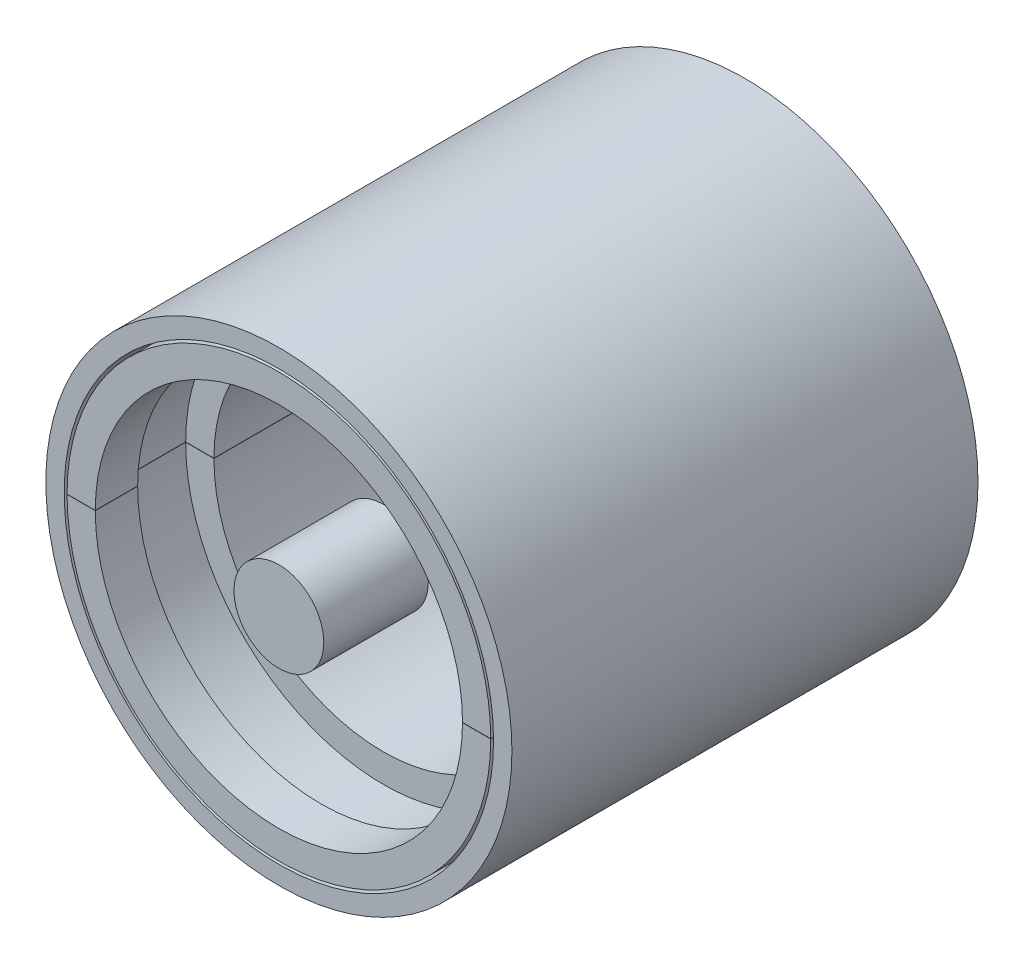
ISO-10303-21;
HEADER;
FILE_DESCRIPTION(('STEP AP214'),'2;1');
FILE_NAME('part.step','',(''),(''),'','','');
FILE_SCHEMA(('AUTOMOTIVE_DESIGN { 1 0 10303 214 1 1 1 1 }'));
ENDSEC;
DATA;
#1=APPLICATION_CONTEXT('core data for automotive mechanical design processes');
#2=APPLICATION_PROTOCOL_DEFINITION('international standard','automotive_design',2000,#1);
#3=PRODUCT_CONTEXT('',#1,'mechanical');
#4=PRODUCT('Part','Part','',(#3));
#5=PRODUCT_RELATED_PRODUCT_CATEGORY('part','',(#4));
#6=PRODUCT_DEFINITION_FORMATION('','',#4);
#7=PRODUCT_DEFINITION_CONTEXT('part definition',#1,'design');
#8=PRODUCT_DEFINITION('design','',#6,#7);
#9=PRODUCT_DEFINITION_SHAPE('','',#8);
#10=(LENGTH_UNIT() NAMED_UNIT(*) SI_UNIT(.MILLI.,.METRE.));
#11=(NAMED_UNIT(*) PLANE_ANGLE_UNIT() SI_UNIT($,.RADIAN.));
#12=(NAMED_UNIT(*) SI_UNIT($,.STERADIAN.) SOLID_ANGLE_UNIT());
#13=UNCERTAINTY_MEASURE_WITH_UNIT(LENGTH_MEASURE(1.E-05),#10,'distance_accuracy_value','');
#14=(GEOMETRIC_REPRESENTATION_CONTEXT(3) GLOBAL_UNCERTAINTY_ASSIGNED_CONTEXT((#13)) GLOBAL_UNIT_ASSIGNED_CONTEXT((#10,
#11,#12)) REPRESENTATION_CONTEXT('',''));
#15=CARTESIAN_POINT('',(0.,0.,0.));
#16=DIRECTION('',(0.,0.,1.));
#17=DIRECTION('',(1.,0.,0.));
#18=AXIS2_PLACEMENT_3D('',#15,#16,#17);
#19=CARTESIAN_POINT('',(0.,0.,-2.2));
#20=DIRECTION('',(0.,0.,1.));
#21=DIRECTION('',(1.,0.,0.));
#22=AXIS2_PLACEMENT_3D('',#19,#20,#21);
#23=CYLINDRICAL_SURFACE('',#22,1.58978961140755);
#24=CARTESIAN_POINT('',(0.,0.,-2.2));
#25=DIRECTION('',(0.,0.,1.));
#26=DIRECTION('',(1.,0.,0.));
#27=AXIS2_PLACEMENT_3D('',#24,#25,#26);
#28=CIRCLE('',#27,1.58978961140755);
#29=CARTESIAN_POINT('',(1.58978961140755,0.,-2.2));
#30=VERTEX_POINT('',#29);
#31=EDGE_CURVE('E11',#30,#30,#28,.T.);
#32=ORIENTED_EDGE('',*,*,#31,.T.);
#33=EDGE_LOOP('',(#32));
#34=FACE_BOUND('',#33,.T.);
#35=CARTESIAN_POINT('',(0.,0.,1.5));
#36=DIRECTION('',(0.,0.,1.));
#37=DIRECTION('',(1.,0.,0.));
#38=AXIS2_PLACEMENT_3D('',#35,#36,#37);
#39=CIRCLE('',#38,1.58978961140755);
#40=CARTESIAN_POINT('',(1.58978961140755,0.,1.5));
#41=VERTEX_POINT('',#40);
#42=EDGE_CURVE('E56',#41,#41,#39,.T.);
#43=ORIENTED_EDGE('',*,*,#42,.F.);
#44=EDGE_LOOP('',(#43));
#45=FACE_BOUND('',#44,.T.);
#46=ADVANCED_FACE('F57',(#34,#45),#23,.T.);
#47=CARTESIAN_POINT('',(0.,0.,-2.2));
#48=DIRECTION('',(0.,0.,1.));
#49=DIRECTION('',(1.,0.,0.));
#50=AXIS2_PLACEMENT_3D('',#47,#48,#49);
#51=PLANE('',#50);
#52=ORIENTED_EDGE('',*,*,#31,.F.);
#53=EDGE_LOOP('',(#52));
#54=FACE_BOUND('',#53,.T.);
#55=ADVANCED_FACE('F71',(#54),#51,.F.);
#56=CARTESIAN_POINT('',(0.,0.,1.5));
#57=DIRECTION('',(0.,0.,1.));
#58=DIRECTION('',(1.,0.,0.));
#59=AXIS2_PLACEMENT_3D('',#56,#57,#58);
#60=PLANE('',#59);
#61=ORIENTED_EDGE('',*,*,#42,.T.);
#62=EDGE_LOOP('',(#61));
#63=FACE_BOUND('',#62,.T.);
#64=ADVANCED_FACE('F69',(#63),#60,.T.);
#65=CLOSED_SHELL('',(#46,#55,#64));
#66=MANIFOLD_SOLID_BREP('B2',#65);
#67=CARTESIAN_POINT('',(0.,0.,-15.));
#68=DIRECTION('',(0.,0.,1.));
#69=DIRECTION('',(1.,0.,0.));
#70=AXIS2_PLACEMENT_3D('',#67,#68,#69);
#71=CYLINDRICAL_SURFACE('',#70,8.25);
#72=CARTESIAN_POINT('',(0.,0.,-15.));
#73=DIRECTION('',(0.,0.,-1.));
#74=DIRECTION('',(-1.,0.,0.));
#75=AXIS2_PLACEMENT_3D('',#72,#73,#74);
#76=CIRCLE('',#75,8.25);
#77=CARTESIAN_POINT('',(-8.25,0.,-15.));
#78=VERTEX_POINT('',#77);
#79=EDGE_CURVE('E54',#78,#78,#76,.T.);
#80=ORIENTED_EDGE('',*,*,#79,.F.);
#81=EDGE_LOOP('',(#80));
#82=FACE_BOUND('',#81,.T.);
#83=CARTESIAN_POINT('',(0.,0.,1.5));
#84=DIRECTION('',(0.,0.,1.));
#85=DIRECTION('',(1.,0.,0.));
#86=AXIS2_PLACEMENT_3D('',#83,#84,#85);
#87=CIRCLE('',#86,8.25);
#88=CARTESIAN_POINT('',(8.25,0.,1.5));
#89=VERTEX_POINT('',#88);
#90=EDGE_CURVE('E112',#89,#89,#87,.T.);
#91=ORIENTED_EDGE('',*,*,#90,.F.);
#92=EDGE_LOOP('',(#91));
#93=FACE_BOUND('',#92,.T.);
#94=ADVANCED_FACE('F110',(#82,#93),#71,.T.);
#95=CARTESIAN_POINT('',(0.,0.,-15.));
#96=DIRECTION('',(0.,0.,-1.));
#97=DIRECTION('',(-1.,0.,0.));
#98=AXIS2_PLACEMENT_3D('',#95,#96,#97);
#99=PLANE('',#98);
#100=CARTESIAN_POINT('',(0.,0.,-15.));
#101=DIRECTION('',(0.,0.,-1.));
#102=DIRECTION('',(-1.,0.,0.));
#103=AXIS2_PLACEMENT_3D('',#100,#101,#102);
#104=CIRCLE('',#103,7.25);
#105=CARTESIAN_POINT('',(-7.25,0.,-15.));
#106=VERTEX_POINT('',#105);
#107=EDGE_CURVE('E127',#106,#106,#104,.T.);
#108=ORIENTED_EDGE('',*,*,#107,.F.);
#109=EDGE_LOOP('',(#108));
#110=FACE_BOUND('',#109,.T.);
#111=ORIENTED_EDGE('',*,*,#79,.T.);
#112=EDGE_LOOP('',(#111));
#113=FACE_BOUND('',#112,.T.);
#114=ADVANCED_FACE('F143',(#110,#113),#99,.T.);
#115=CARTESIAN_POINT('',(0.,0.,1.5));
#116=DIRECTION('',(0.,0.,1.));
#117=DIRECTION('',(1.,0.,0.));
#118=AXIS2_PLACEMENT_3D('',#115,#116,#117);
#119=PLANE('',#118);
#120=ORIENTED_EDGE('',*,*,#90,.T.);
#121=EDGE_LOOP('',(#120));
#122=FACE_BOUND('',#121,.T.);
#123=CARTESIAN_POINT('',(0.,0.,1.5));
#124=DIRECTION('',(0.,0.,1.));
#125=DIRECTION('',(1.,0.,0.));
#126=AXIS2_PLACEMENT_3D('',#123,#124,#125);
#127=CIRCLE('',#126,7.6);
#128=CARTESIAN_POINT('',(7.6,0.,1.5));
#129=VERTEX_POINT('',#128);
#130=EDGE_CURVE('E117',#129,#129,#127,.T.);
#131=ORIENTED_EDGE('',*,*,#130,.F.);
#132=EDGE_LOOP('',(#131));
#133=FACE_BOUND('',#132,.T.);
#134=ADVANCED_FACE('F151',(#122,#133),#119,.T.);
#135=CARTESIAN_POINT('',(0.,0.,1.5));
#136=DIRECTION('',(0.,0.,-1.));
#137=DIRECTION('',(-1.,0.,0.));
#138=AXIS2_PLACEMENT_3D('',#135,#136,#137);
#139=CYLINDRICAL_SURFACE('',#138,7.6);
#140=ORIENTED_EDGE('',*,*,#130,.T.);
#141=EDGE_LOOP('',(#140));
#142=FACE_BOUND('',#141,.T.);
#143=CARTESIAN_POINT('',(0.,0.,-14.));
#144=DIRECTION('',(0.,0.,1.));
#145=DIRECTION('',(1.,0.,0.));
#146=AXIS2_PLACEMENT_3D('',#143,#144,#145);
#147=CIRCLE('',#146,7.6);
#148=CARTESIAN_POINT('',(7.6,0.,-14.));
#149=VERTEX_POINT('',#148);
#150=EDGE_CURVE('E122',#149,#149,#147,.T.);
#151=ORIENTED_EDGE('',*,*,#150,.F.);
#152=EDGE_LOOP('',(#151));
#153=FACE_BOUND('',#152,.T.);
#154=ADVANCED_FACE('F145',(#142,#153),#139,.F.);
#155=CARTESIAN_POINT('',(0.,0.,-14.));
#156=DIRECTION('',(0.,0.,-1.));
#157=DIRECTION('',(-1.,0.,0.));
#158=AXIS2_PLACEMENT_3D('',#155,#156,#157);
#159=PLANE('',#158);
#160=CARTESIAN_POINT('',(0.,0.,-14.));
#161=DIRECTION('',(0.,0.,-1.));
#162=DIRECTION('',(-1.,0.,0.));
#163=AXIS2_PLACEMENT_3D('',#160,#161,#162);
#164=CIRCLE('',#163,7.25);
#165=CARTESIAN_POINT('',(-7.25,0.,-14.));
#166=VERTEX_POINT('',#165);
#167=EDGE_CURVE('E109',#166,#166,#164,.T.);
#168=ORIENTED_EDGE('',*,*,#167,.T.);
#169=EDGE_LOOP('',(#168));
#170=FACE_BOUND('',#169,.T.);
#171=ORIENTED_EDGE('',*,*,#150,.T.);
#172=EDGE_LOOP('',(#171));
#173=FACE_BOUND('',#172,.T.);
#174=ADVANCED_FACE('F134',(#170,#173),#159,.F.);
#175=CARTESIAN_POINT('',(0.,0.,22.0060966544099));
#176=DIRECTION('',(0.,0.,-1.));
#177=DIRECTION('',(-1.,0.,0.));
#178=AXIS2_PLACEMENT_3D('',#175,#176,#177);
#179=CYLINDRICAL_SURFACE('',#178,7.25);
#180=ORIENTED_EDGE('',*,*,#107,.T.);
#181=EDGE_LOOP('',(#180));
#182=FACE_BOUND('',#181,.T.);
#183=ORIENTED_EDGE('',*,*,#167,.F.);
#184=EDGE_LOOP('',(#183));
#185=FACE_BOUND('',#184,.T.);
#186=ADVANCED_FACE('F136',(#182,#185),#179,.F.);
#187=CLOSED_SHELL('',(#94,#114,#134,#154,#174,#186));
#188=MANIFOLD_SOLID_BREP('B6_NOT_SHOWN',#187);
#189=CARTESIAN_POINT('',(0.,0.,-8.));
#190=DIRECTION('',(0.,0.,1.));
#191=DIRECTION('',(1.,0.,0.));
#192=AXIS2_PLACEMENT_3D('',#189,#190,#191);
#193=CYLINDRICAL_SURFACE('',#192,7.);
#194=DIRECTION('',(0.,0.,1.));
#195=VECTOR('',#194,1.);
#196=CARTESIAN_POINT('',(6.99999821428549,-0.00500000000000001,-8.));
#197=LINE('',#196,#195);
#198=CARTESIAN_POINT('',(6.99999821428549,-0.00500000000000001,-2.2));
#199=VERTEX_POINT('',#198);
#200=CARTESIAN_POINT('',(6.99999821428549,-0.00500000000000001,0.));
#201=VERTEX_POINT('',#200);
#202=EDGE_CURVE('E232',#199,#201,#197,.T.);
#203=ORIENTED_EDGE('',*,*,#202,.F.);
#204=CARTESIAN_POINT('',(0.,0.,-2.2));
#205=DIRECTION('',(0.,0.,-1.));
#206=DIRECTION('',(-1.,0.,0.));
#207=AXIS2_PLACEMENT_3D('',#204,#205,#206);
#208=CIRCLE('',#207,7.);
#209=CARTESIAN_POINT('',(-6.99999821428549,-0.00500000000000001,-2.2));
#210=VERTEX_POINT('',#209);
#211=EDGE_CURVE('E229',#199,#210,#208,.T.);
#212=ORIENTED_EDGE('',*,*,#211,.T.);
#213=DIRECTION('',(0.,0.,1.));
#214=VECTOR('',#213,1.);
#215=CARTESIAN_POINT('',(-6.99999821428549,-0.00500000000000001,-8.));
#216=LINE('',#215,#214);
#217=CARTESIAN_POINT('',(-6.99999821428549,-0.00500000000000001,0.));
#218=VERTEX_POINT('',#217);
#219=EDGE_CURVE('E329',#218,#210,#216,.F.);
#220=ORIENTED_EDGE('',*,*,#219,.F.);
#221=CARTESIAN_POINT('',(0.,0.,0.));
#222=DIRECTION('',(0.,0.,-1.));
#223=DIRECTION('',(-1.,0.,0.));
#224=AXIS2_PLACEMENT_3D('',#221,#222,#223);
#225=CIRCLE('',#224,7.);
#226=EDGE_CURVE('E380',#201,#218,#225,.T.);
#227=ORIENTED_EDGE('',*,*,#226,.F.);
#228=EDGE_LOOP('',(#203,#212,#220,#227));
#229=FACE_BOUND('',#228,.T.);
#230=ADVANCED_FACE('F212',(#229),#193,.F.);
#231=CARTESIAN_POINT('',(0.,0.,-14.));
#232=DIRECTION('',(0.,0.,-1.));
#233=DIRECTION('',(-1.,0.,0.));
#234=AXIS2_PLACEMENT_3D('',#231,#232,#233);
#235=PLANE('',#234);
#236=CARTESIAN_POINT('',(0.,0.,-14.));
#237=DIRECTION('',(0.,0.,-1.));
#238=DIRECTION('',(-1.,0.,0.));
#239=AXIS2_PLACEMENT_3D('',#236,#237,#238);
#240=CIRCLE('',#239,7.5);
#241=CARTESIAN_POINT('',(7.49999833333315,-0.00500000000000001,-14.));
#242=VERTEX_POINT('',#241);
#243=CARTESIAN_POINT('',(-7.49999833333315,-0.00500000000000001,-14.));
#244=VERTEX_POINT('',#243);
#245=EDGE_CURVE('E357',#242,#244,#240,.T.);
#246=ORIENTED_EDGE('',*,*,#245,.T.);
#247=DIRECTION('',(1.,0.,0.));
#248=VECTOR('',#247,1.);
#249=CARTESIAN_POINT('',(-8.57100512255708,-0.00500000000000001,-14.));
#250=LINE('',#249,#248);
#251=CARTESIAN_POINT('',(-4.99999749999937,-0.00500000000000001,-14.));
#252=VERTEX_POINT('',#251);
#253=EDGE_CURVE('E431',#244,#252,#250,.T.);
#254=ORIENTED_EDGE('',*,*,#253,.T.);
#255=CARTESIAN_POINT('',(0.,0.,-14.));
#256=DIRECTION('',(0.,0.,-1.));
#257=DIRECTION('',(-1.,0.,0.));
#258=AXIS2_PLACEMENT_3D('',#255,#256,#257);
#259=CIRCLE('',#258,5.);
#260=CARTESIAN_POINT('',(4.99999749999937,-0.00500000000000001,-14.));
#261=VERTEX_POINT('',#260);
#262=EDGE_CURVE('E426',#261,#252,#259,.T.);
#263=ORIENTED_EDGE('',*,*,#262,.F.);
#264=EDGE_CURVE('E381',#261,#242,#250,.T.);
#265=ORIENTED_EDGE('',*,*,#264,.T.);
#266=EDGE_LOOP('',(#246,#254,#263,#265));
#267=FACE_BOUND('',#266,.T.);
#268=ADVANCED_FACE('F468',(#267),#235,.T.);
#269=CARTESIAN_POINT('',(0.,0.,-8.));
#270=DIRECTION('',(0.,0.,-1.));
#271=DIRECTION('',(-1.,0.,0.));
#272=AXIS2_PLACEMENT_3D('',#269,#270,#271);
#273=PLANE('',#272);
#274=DIRECTION('',(-1.,0.,0.));
#275=VECTOR('',#274,1.);
#276=CARTESIAN_POINT('',(0.,-0.00500000000000001,-8.));
#277=LINE('',#276,#275);
#278=CARTESIAN_POINT('',(7.06965404622697,-0.00500000000000001,-8.));
#279=VERTEX_POINT('',#278);
#280=CARTESIAN_POINT('',(5.99999791666631,-0.00500000000000001,-8.));
#281=VERTEX_POINT('',#280);
#282=EDGE_CURVE('E407',#279,#281,#277,.T.);
#283=ORIENTED_EDGE('',*,*,#282,.F.);
#284=DIRECTION('',(-0.5,-0.866025403784439,0.));
#285=VECTOR('',#284,1.);
#286=CARTESIAN_POINT('',(7.07254079757292,0.,-8.));
#287=LINE('',#286,#285);
#288=CARTESIAN_POINT('',(3.53627039878646,-6.125,-8.));
#289=VERTEX_POINT('',#288);
#290=EDGE_CURVE('E382',#279,#289,#287,.T.);
#291=ORIENTED_EDGE('',*,*,#290,.T.);
#292=DIRECTION('',(-1.,0.,0.));
#293=VECTOR('',#292,1.);
#294=CARTESIAN_POINT('',(3.53627039878646,-6.125,-8.));
#295=LINE('',#294,#293);
#296=CARTESIAN_POINT('',(-3.53627039878646,-6.125,-8.));
#297=VERTEX_POINT('',#296);
#298=EDGE_CURVE('E377',#289,#297,#295,.T.);
#299=ORIENTED_EDGE('',*,*,#298,.T.);
#300=DIRECTION('',(-0.5,0.866025403784439,0.));
#301=VECTOR('',#300,1.);
#302=CARTESIAN_POINT('',(-3.53627039878646,-6.125,-8.));
#303=LINE('',#302,#301);
#304=CARTESIAN_POINT('',(-7.06965404622697,-0.0049999999999998,-8.));
#305=VERTEX_POINT('',#304);
#306=EDGE_CURVE('E324',#297,#305,#303,.T.);
#307=ORIENTED_EDGE('',*,*,#306,.T.);
#308=DIRECTION('',(-1.,0.,0.));
#309=VECTOR('',#308,1.);
#310=CARTESIAN_POINT('',(0.,-0.00500000000000001,-8.));
#311=LINE('',#310,#309);
#312=CARTESIAN_POINT('',(-5.99999791666631,-0.00500000000000001,-8.));
#313=VERTEX_POINT('',#312);
#314=EDGE_CURVE('E314',#313,#305,#311,.T.);
#315=ORIENTED_EDGE('',*,*,#314,.F.);
#316=CARTESIAN_POINT('',(0.,0.,-8.));
#317=DIRECTION('',(0.,0.,-1.));
#318=DIRECTION('',(-1.,0.,0.));
#319=AXIS2_PLACEMENT_3D('',#316,#317,#318);
#320=CIRCLE('',#319,6.);
#321=EDGE_CURVE('E318',#281,#313,#320,.T.);
#322=ORIENTED_EDGE('',*,*,#321,.F.);
#323=EDGE_LOOP('',(#283,#291,#299,#307,#315,#322));
#324=FACE_BOUND('',#323,.T.);
#325=ADVANCED_FACE('F319',(#324),#273,.T.);
#326=CARTESIAN_POINT('',(0.,0.,0.));
#327=DIRECTION('',(0.,0.,1.));
#328=DIRECTION('',(1.,0.,0.));
#329=AXIS2_PLACEMENT_3D('',#326,#327,#328);
#330=PLANE('',#329);
#331=ORIENTED_EDGE('',*,*,#226,.T.);
#332=DIRECTION('',(1.,0.,0.));
#333=VECTOR('',#332,1.);
#334=CARTESIAN_POINT('',(0.,-0.00500000000000001,0.));
#335=LINE('',#334,#333);
#336=CARTESIAN_POINT('',(-6.49999807692279,-0.00500000000000001,0.));
#337=VERTEX_POINT('',#336);
#338=EDGE_CURVE('E413',#218,#337,#335,.T.);
#339=ORIENTED_EDGE('',*,*,#338,.T.);
#340=CARTESIAN_POINT('',(0.,0.,0.));
#341=DIRECTION('',(0.,0.,1.));
#342=DIRECTION('',(1.,0.,0.));
#343=AXIS2_PLACEMENT_3D('',#340,#341,#342);
#344=CIRCLE('',#343,6.5);
#345=CARTESIAN_POINT('',(6.49999807692279,-0.00500000000000001,0.));
#346=VERTEX_POINT('',#345);
#347=EDGE_CURVE('E419',#337,#346,#344,.T.);
#348=ORIENTED_EDGE('',*,*,#347,.T.);
#349=EDGE_CURVE('E418',#346,#201,#335,.T.);
#350=ORIENTED_EDGE('',*,*,#349,.T.);
#351=EDGE_LOOP('',(#331,#339,#348,#350));
#352=FACE_BOUND('',#351,.T.);
#353=ADVANCED_FACE('F466',(#352),#330,.F.);
#354=CARTESIAN_POINT('',(0.,0.,1.5));
#355=DIRECTION('',(0.,0.,1.));
#356=DIRECTION('',(1.,0.,0.));
#357=AXIS2_PLACEMENT_3D('',#354,#355,#356);
#358=PLANE('',#357);
#359=DIRECTION('',(1.,0.,0.));
#360=VECTOR('',#359,1.);
#361=CARTESIAN_POINT('',(-8.57100512255708,-0.00500000000000001,1.5));
#362=LINE('',#361,#360);
#363=CARTESIAN_POINT('',(-7.49999833333315,-0.00500000000000001,1.5));
#364=VERTEX_POINT('',#363);
#365=CARTESIAN_POINT('',(-6.49999807692279,-0.00500000000000001,1.5));
#366=VERTEX_POINT('',#365);
#367=EDGE_CURVE('E224',#364,#366,#362,.T.);
#368=ORIENTED_EDGE('',*,*,#367,.F.);
#369=CARTESIAN_POINT('',(0.,0.,1.5));
#370=DIRECTION('',(0.,0.,1.));
#371=DIRECTION('',(1.,0.,0.));
#372=AXIS2_PLACEMENT_3D('',#369,#370,#371);
#373=CIRCLE('',#372,7.5);
#374=CARTESIAN_POINT('',(7.49999833333315,-0.00500000000000001,1.5));
#375=VERTEX_POINT('',#374);
#376=EDGE_CURVE('E398',#364,#375,#373,.T.);
#377=ORIENTED_EDGE('',*,*,#376,.T.);
#378=CARTESIAN_POINT('',(6.49999807692279,-0.00500000000000001,1.5));
#379=VERTEX_POINT('',#378);
#380=EDGE_CURVE('E102',#379,#375,#362,.T.);
#381=ORIENTED_EDGE('',*,*,#380,.F.);
#382=CARTESIAN_POINT('',(0.,0.,1.5));
#383=DIRECTION('',(0.,0.,1.));
#384=DIRECTION('',(1.,0.,0.));
#385=AXIS2_PLACEMENT_3D('',#382,#383,#384);
#386=CIRCLE('',#385,6.5);
#387=EDGE_CURVE('E393',#366,#379,#386,.T.);
#388=ORIENTED_EDGE('',*,*,#387,.F.);
#389=EDGE_LOOP('',(#368,#377,#381,#388));
#390=FACE_BOUND('',#389,.T.);
#391=ADVANCED_FACE('F214',(#390),#358,.T.);
#392=CARTESIAN_POINT('',(0.,0.,1.5));
#393=DIRECTION('',(0.,0.,-1.));
#394=DIRECTION('',(-1.,0.,0.));
#395=AXIS2_PLACEMENT_3D('',#392,#393,#394);
#396=CYLINDRICAL_SURFACE('',#395,7.5);
#397=DIRECTION('',(0.,0.,-1.));
#398=VECTOR('',#397,1.);
#399=CARTESIAN_POINT('',(7.49999833333315,-0.00500000000000001,1.5));
#400=LINE('',#399,#398);
#401=EDGE_CURVE('E399',#242,#375,#400,.F.);
#402=ORIENTED_EDGE('',*,*,#401,.T.);
#403=ORIENTED_EDGE('',*,*,#376,.F.);
#404=DIRECTION('',(0.,0.,-1.));
#405=VECTOR('',#404,1.);
#406=CARTESIAN_POINT('',(-7.49999833333315,-0.00500000000000001,1.5));
#407=LINE('',#406,#405);
#408=EDGE_CURVE('E395',#364,#244,#407,.T.);
#409=ORIENTED_EDGE('',*,*,#408,.T.);
#410=ORIENTED_EDGE('',*,*,#245,.F.);
#411=EDGE_LOOP('',(#402,#403,#409,#410));
#412=FACE_BOUND('',#411,.T.);
#413=ADVANCED_FACE('F480',(#412),#396,.T.);
#414=CARTESIAN_POINT('',(0.,0.,1.5));
#415=DIRECTION('',(0.,0.,-1.));
#416=DIRECTION('',(-1.,0.,0.));
#417=AXIS2_PLACEMENT_3D('',#414,#415,#416);
#418=CYLINDRICAL_SURFACE('',#417,6.5);
#419=DIRECTION('',(0.,0.,-1.));
#420=VECTOR('',#419,1.);
#421=CARTESIAN_POINT('',(-6.49999807692279,-0.00500000000000001,1.5));
#422=LINE('',#421,#420);
#423=EDGE_CURVE('E411',#366,#337,#422,.T.);
#424=ORIENTED_EDGE('',*,*,#423,.F.);
#425=ORIENTED_EDGE('',*,*,#387,.T.);
#426=DIRECTION('',(0.,0.,-1.));
#427=VECTOR('',#426,1.);
#428=CARTESIAN_POINT('',(6.49999807692279,-0.00500000000000001,1.5));
#429=LINE('',#428,#427);
#430=EDGE_CURVE('E221',#346,#379,#429,.F.);
#431=ORIENTED_EDGE('',*,*,#430,.F.);
#432=ORIENTED_EDGE('',*,*,#347,.F.);
#433=EDGE_LOOP('',(#424,#425,#431,#432));
#434=FACE_BOUND('',#433,.T.);
#435=ADVANCED_FACE('F461',(#434),#418,.F.);
#436=CARTESIAN_POINT('',(7.07254079757292,0.,-12.75));
#437=DIRECTION('',(-0.866025403784439,0.5,0.));
#438=DIRECTION('',(-0.5,-0.866025403784439,0.));
#439=AXIS2_PLACEMENT_3D('',#436,#437,#438);
#440=PLANE('',#439);
#441=DIRECTION('',(0.,0.,1.));
#442=VECTOR('',#441,1.);
#443=CARTESIAN_POINT('',(7.06965404622697,-0.00500000000000001,-12.75));
#444=LINE('',#443,#442);
#445=CARTESIAN_POINT('',(7.06965404622697,-0.00499999999999997,-12.75));
#446=VERTEX_POINT('',#445);
#447=EDGE_CURVE('E363',#446,#279,#444,.T.);
#448=ORIENTED_EDGE('',*,*,#447,.F.);
#449=DIRECTION('',(-0.5,-0.866025403784439,0.));
#450=VECTOR('',#449,1.);
#451=CARTESIAN_POINT('',(7.07254079757292,0.,-12.75));
#452=LINE('',#451,#450);
#453=CARTESIAN_POINT('',(3.53627039878646,-6.125,-12.75));
#454=VERTEX_POINT('',#453);
#455=EDGE_CURVE('E367',#446,#454,#452,.T.);
#456=ORIENTED_EDGE('',*,*,#455,.T.);
#457=DIRECTION('',(0.,0.,1.));
#458=VECTOR('',#457,1.);
#459=CARTESIAN_POINT('',(3.53627039878646,-6.125,-12.75));
#460=LINE('',#459,#458);
#461=EDGE_CURVE('E362',#454,#289,#460,.T.);
#462=ORIENTED_EDGE('',*,*,#461,.T.);
#463=ORIENTED_EDGE('',*,*,#290,.F.);
#464=EDGE_LOOP('',(#448,#456,#462,#463));
#465=FACE_BOUND('',#464,.T.);
#466=ADVANCED_FACE('F488',(#465),#440,.T.);
#467=CARTESIAN_POINT('',(3.53627039878646,-6.125,-12.75));
#468=DIRECTION('',(0.,1.,0.));
#469=DIRECTION('',(-1.,0.,0.));
#470=AXIS2_PLACEMENT_3D('',#467,#468,#469);
#471=PLANE('',#470);
#472=ORIENTED_EDGE('',*,*,#298,.F.);
#473=ORIENTED_EDGE('',*,*,#461,.F.);
#474=DIRECTION('',(-1.,0.,0.));
#475=VECTOR('',#474,1.);
#476=CARTESIAN_POINT('',(3.53627039878646,-6.125,-12.75));
#477=LINE('',#476,#475);
#478=CARTESIAN_POINT('',(-3.53627039878646,-6.125,-12.75));
#479=VERTEX_POINT('',#478);
#480=EDGE_CURVE('E368',#454,#479,#477,.T.);
#481=ORIENTED_EDGE('',*,*,#480,.T.);
#482=DIRECTION('',(0.,0.,1.));
#483=VECTOR('',#482,1.);
#484=CARTESIAN_POINT('',(-3.53627039878646,-6.125,-12.75));
#485=LINE('',#484,#483);
#486=EDGE_CURVE('E369',#479,#297,#485,.T.);
#487=ORIENTED_EDGE('',*,*,#486,.T.);
#488=EDGE_LOOP('',(#472,#473,#481,#487));
#489=FACE_BOUND('',#488,.T.);
#490=ADVANCED_FACE('F516',(#489),#471,.T.);
#491=CARTESIAN_POINT('',(-3.53627039878646,-6.125,-12.75));
#492=DIRECTION('',(0.866025403784439,0.5,0.));
#493=DIRECTION('',(-0.5,0.866025403784439,0.));
#494=AXIS2_PLACEMENT_3D('',#491,#492,#493);
#495=PLANE('',#494);
#496=DIRECTION('',(0.,0.,-1.));
#497=VECTOR('',#496,1.);
#498=CARTESIAN_POINT('',(-7.06965404622697,-0.0049999999999998,-12.75));
#499=LINE('',#498,#497);
#500=CARTESIAN_POINT('',(-7.06965404622697,-0.00499999999999947,-12.75));
#501=VERTEX_POINT('',#500);
#502=EDGE_CURVE('E327',#305,#501,#499,.T.);
#503=ORIENTED_EDGE('',*,*,#502,.F.);
#504=ORIENTED_EDGE('',*,*,#306,.F.);
#505=ORIENTED_EDGE('',*,*,#486,.F.);
#506=DIRECTION('',(-0.5,0.866025403784439,0.));
#507=VECTOR('',#506,1.);
#508=CARTESIAN_POINT('',(-3.53627039878646,-6.125,-12.75));
#509=LINE('',#508,#507);
#510=EDGE_CURVE('E372',#479,#501,#509,.T.);
#511=ORIENTED_EDGE('',*,*,#510,.T.);
#512=EDGE_LOOP('',(#503,#504,#505,#511));
#513=FACE_BOUND('',#512,.T.);
#514=ADVANCED_FACE('F522',(#513),#495,.T.);
#515=CARTESIAN_POINT('',(0.,0.,-12.75));
#516=DIRECTION('',(0.,0.,-1.));
#517=DIRECTION('',(-1.,0.,0.));
#518=AXIS2_PLACEMENT_3D('',#515,#516,#517);
#519=PLANE('',#518);
#520=ORIENTED_EDGE('',*,*,#455,.F.);
#521=DIRECTION('',(-1.,0.,0.));
#522=VECTOR('',#521,1.);
#523=CARTESIAN_POINT('',(0.,-0.00500000000000001,-12.75));
#524=LINE('',#523,#522);
#525=CARTESIAN_POINT('',(4.99999749999937,-0.00500000000000001,-12.75));
#526=VERTEX_POINT('',#525);
#527=EDGE_CURVE('E389',#446,#526,#524,.T.);
#528=ORIENTED_EDGE('',*,*,#527,.T.);
#529=CARTESIAN_POINT('',(0.,0.,-12.75));
#530=DIRECTION('',(0.,0.,-1.));
#531=DIRECTION('',(-1.,0.,0.));
#532=AXIS2_PLACEMENT_3D('',#529,#530,#531);
#533=CIRCLE('',#532,5.);
#534=CARTESIAN_POINT('',(-4.99999749999937,-0.00500000000000001,-12.75));
#535=VERTEX_POINT('',#534);
#536=EDGE_CURVE('E213',#526,#535,#533,.T.);
#537=ORIENTED_EDGE('',*,*,#536,.T.);
#538=EDGE_CURVE('E425',#535,#501,#524,.T.);
#539=ORIENTED_EDGE('',*,*,#538,.T.);
#540=ORIENTED_EDGE('',*,*,#510,.F.);
#541=ORIENTED_EDGE('',*,*,#480,.F.);
#542=EDGE_LOOP('',(#520,#528,#537,#539,#540,#541));
#543=FACE_BOUND('',#542,.T.);
#544=ADVANCED_FACE('F498',(#543),#519,.F.);
#545=CARTESIAN_POINT('',(0.,0.,-14.));
#546=DIRECTION('',(0.,0.,1.));
#547=DIRECTION('',(1.,0.,0.));
#548=AXIS2_PLACEMENT_3D('',#545,#546,#547);
#549=CYLINDRICAL_SURFACE('',#548,5.);
#550=DIRECTION('',(0.,0.,1.));
#551=VECTOR('',#550,1.);
#552=CARTESIAN_POINT('',(4.99999749999937,-0.00500000000000001,-14.));
#553=LINE('',#552,#551);
#554=EDGE_CURVE('E356',#261,#526,#553,.T.);
#555=ORIENTED_EDGE('',*,*,#554,.F.);
#556=ORIENTED_EDGE('',*,*,#262,.T.);
#557=DIRECTION('',(0.,0.,1.));
#558=VECTOR('',#557,1.);
#559=CARTESIAN_POINT('',(-4.99999749999937,-0.00500000000000001,-14.));
#560=LINE('',#559,#558);
#561=EDGE_CURVE('E365',#535,#252,#560,.F.);
#562=ORIENTED_EDGE('',*,*,#561,.F.);
#563=ORIENTED_EDGE('',*,*,#536,.F.);
#564=EDGE_LOOP('',(#555,#556,#562,#563));
#565=FACE_BOUND('',#564,.T.);
#566=ADVANCED_FACE('F493',(#565),#549,.F.);
#567=CARTESIAN_POINT('',(-8.57100512255708,-0.00500000000000001,-30.797201074288));
#568=DIRECTION('',(0.,-1.,0.));
#569=DIRECTION('',(0.,0.,-1.));
#570=AXIS2_PLACEMENT_3D('',#567,#568,#569);
#571=PLANE('',#570);
#572=ORIENTED_EDGE('',*,*,#219,.T.);
#573=DIRECTION('',(-1.,0.,0.));
#574=VECTOR('',#573,1.);
#575=CARTESIAN_POINT('',(0.,-0.00500000000000001,-2.2));
#576=LINE('',#575,#574);
#577=CARTESIAN_POINT('',(-5.99999791666631,-0.00500000000000001,-2.2));
#578=VERTEX_POINT('',#577);
#579=EDGE_CURVE('E333',#578,#210,#576,.T.);
#580=ORIENTED_EDGE('',*,*,#579,.F.);
#581=DIRECTION('',(0.,0.,1.));
#582=VECTOR('',#581,1.);
#583=CARTESIAN_POINT('',(-5.99999791666631,-0.00500000000000001,-24.7682713778135));
#584=LINE('',#583,#582);
#585=EDGE_CURVE('E331',#313,#578,#584,.T.);
#586=ORIENTED_EDGE('',*,*,#585,.F.);
#587=ORIENTED_EDGE('',*,*,#314,.T.);
#588=ORIENTED_EDGE('',*,*,#502,.T.);
#589=ORIENTED_EDGE('',*,*,#538,.F.);
#590=ORIENTED_EDGE('',*,*,#561,.T.);
#591=ORIENTED_EDGE('',*,*,#253,.F.);
#592=ORIENTED_EDGE('',*,*,#408,.F.);
#593=ORIENTED_EDGE('',*,*,#367,.T.);
#594=ORIENTED_EDGE('',*,*,#423,.T.);
#595=ORIENTED_EDGE('',*,*,#338,.F.);
#596=EDGE_LOOP('',(#572,#580,#586,#587,#588,#589,#590,#591,#592,#593,#594,#595));
#597=FACE_BOUND('',#596,.T.);
#598=ADVANCED_FACE('F332',(#597),#571,.F.);
#599=ORIENTED_EDGE('',*,*,#380,.T.);
#600=ORIENTED_EDGE('',*,*,#401,.F.);
#601=ORIENTED_EDGE('',*,*,#264,.F.);
#602=ORIENTED_EDGE('',*,*,#554,.T.);
#603=ORIENTED_EDGE('',*,*,#527,.F.);
#604=ORIENTED_EDGE('',*,*,#447,.T.);
#605=ORIENTED_EDGE('',*,*,#282,.T.);
#606=DIRECTION('',(0.,0.,1.));
#607=VECTOR('',#606,1.);
#608=CARTESIAN_POINT('',(5.99999791666631,-0.00500000000000001,-24.7682713778135));
#609=LINE('',#608,#607);
#610=CARTESIAN_POINT('',(5.99999791666631,-0.00500000000000001,-2.2));
#611=VERTEX_POINT('',#610);
#612=EDGE_CURVE('E339',#281,#611,#609,.T.);
#613=ORIENTED_EDGE('',*,*,#612,.T.);
#614=EDGE_CURVE('E350',#199,#611,#576,.T.);
#615=ORIENTED_EDGE('',*,*,#614,.F.);
#616=ORIENTED_EDGE('',*,*,#202,.T.);
#617=ORIENTED_EDGE('',*,*,#349,.F.);
#618=ORIENTED_EDGE('',*,*,#430,.T.);
#619=EDGE_LOOP('',(#599,#600,#601,#602,#603,#604,#605,#613,#615,#616,#617,#618));
#620=FACE_BOUND('',#619,.T.);
#621=ADVANCED_FACE('F465',(#620),#571,.F.);
#622=CARTESIAN_POINT('',(0.,0.,-2.2));
#623=DIRECTION('',(0.,0.,-1.));
#624=DIRECTION('',(-1.,0.,0.));
#625=AXIS2_PLACEMENT_3D('',#622,#623,#624);
#626=PLANE('',#625);
#627=ORIENTED_EDGE('',*,*,#211,.F.);
#628=ORIENTED_EDGE('',*,*,#614,.T.);
#629=CARTESIAN_POINT('',(0.,0.,-2.2));
#630=DIRECTION('',(0.,0.,-1.));
#631=DIRECTION('',(-1.,0.,0.));
#632=AXIS2_PLACEMENT_3D('',#629,#630,#631);
#633=CIRCLE('',#632,6.);
#634=EDGE_CURVE('E349',#611,#578,#633,.T.);
#635=ORIENTED_EDGE('',*,*,#634,.T.);
#636=ORIENTED_EDGE('',*,*,#579,.T.);
#637=EDGE_LOOP('',(#627,#628,#635,#636));
#638=FACE_BOUND('',#637,.T.);
#639=ADVANCED_FACE('F507',(#638),#626,.F.);
#640=CARTESIAN_POINT('',(0.,0.,-24.7682713778135));
#641=DIRECTION('',(0.,0.,1.));
#642=DIRECTION('',(1.,0.,0.));
#643=AXIS2_PLACEMENT_3D('',#640,#641,#642);
#644=CYLINDRICAL_SURFACE('',#643,6.);
#645=ORIENTED_EDGE('',*,*,#612,.F.);
#646=ORIENTED_EDGE('',*,*,#321,.T.);
#647=ORIENTED_EDGE('',*,*,#585,.T.);
#648=ORIENTED_EDGE('',*,*,#634,.F.);
#649=EDGE_LOOP('',(#645,#646,#647,#648));
#650=FACE_BOUND('',#649,.T.);
#651=ADVANCED_FACE('F342',(#650),#644,.F.);
#652=CLOSED_SHELL('',(#230,#268,#325,#353,#391,#413,#435,#466,#490,#514,#544,#566,#598,#621,
#639,#651));
#653=MANIFOLD_SOLID_BREP('B49',#652);
#654=CARTESIAN_POINT('',(0.,0.,-8.));
#655=DIRECTION('',(0.,0.,1.));
#656=DIRECTION('',(1.,0.,0.));
#657=AXIS2_PLACEMENT_3D('',#654,#655,#656);
#658=CYLINDRICAL_SURFACE('',#657,7.);
#659=DIRECTION('',(0.,0.,1.));
#660=VECTOR('',#659,1.);
#661=CARTESIAN_POINT('',(-6.99999821428549,0.00500000000000001,-8.));
#662=LINE('',#661,#660);
#663=CARTESIAN_POINT('',(-6.99999821428549,0.00500000000000001,0.));
#664=VERTEX_POINT('',#663);
#665=CARTESIAN_POINT('',(-6.99999821428549,0.00500000000000001,-2.2));
#666=VERTEX_POINT('',#665);
#667=EDGE_CURVE('E830',#664,#666,#662,.F.);
#668=ORIENTED_EDGE('',*,*,#667,.T.);
#669=CARTESIAN_POINT('',(0.,0.,-2.2));
#670=DIRECTION('',(0.,0.,-1.));
#671=DIRECTION('',(-1.,0.,0.));
#672=AXIS2_PLACEMENT_3D('',#669,#670,#671);
#673=CIRCLE('',#672,7.);
#674=CARTESIAN_POINT('',(6.99999821428549,0.00500000000000001,-2.2));
#675=VERTEX_POINT('',#674);
#676=EDGE_CURVE('E805',#666,#675,#673,.T.);
#677=ORIENTED_EDGE('',*,*,#676,.T.);
#678=DIRECTION('',(0.,0.,1.));
#679=VECTOR('',#678,1.);
#680=CARTESIAN_POINT('',(6.99999821428549,0.00500000000000001,-8.));
#681=LINE('',#680,#679);
#682=CARTESIAN_POINT('',(6.99999821428549,0.00500000000000001,0.));
#683=VERTEX_POINT('',#682);
#684=EDGE_CURVE('E778',#675,#683,#681,.T.);
#685=ORIENTED_EDGE('',*,*,#684,.T.);
#686=CARTESIAN_POINT('',(0.,0.,0.));
#687=DIRECTION('',(0.,0.,-1.));
#688=DIRECTION('',(-1.,0.,0.));
#689=AXIS2_PLACEMENT_3D('',#686,#687,#688);
#690=CIRCLE('',#689,7.);
#691=EDGE_CURVE('E893',#664,#683,#690,.T.);
#692=ORIENTED_EDGE('',*,*,#691,.F.);
#693=EDGE_LOOP('',(#668,#677,#685,#692));
#694=FACE_BOUND('',#693,.T.);
#695=ADVANCED_FACE('F669',(#694),#658,.F.);
#696=CARTESIAN_POINT('',(0.,0.,-8.));
#697=DIRECTION('',(0.,0.,-1.));
#698=DIRECTION('',(-1.,0.,0.));
#699=AXIS2_PLACEMENT_3D('',#696,#697,#698);
#700=PLANE('',#699);
#701=DIRECTION('',(1.,0.,0.));
#702=VECTOR('',#701,1.);
#703=CARTESIAN_POINT('',(-3.53627039878646,6.12500000000001,-8.));
#704=LINE('',#703,#702);
#705=CARTESIAN_POINT('',(-3.53627039878646,6.12500000000001,-8.));
#706=VERTEX_POINT('',#705);
#707=CARTESIAN_POINT('',(3.53627039878646,6.125,-8.));
#708=VERTEX_POINT('',#707);
#709=EDGE_CURVE('E885',#706,#708,#704,.T.);
#710=ORIENTED_EDGE('',*,*,#709,.T.);
#711=DIRECTION('',(0.5,-0.866025403784439,0.));
#712=VECTOR('',#711,1.);
#713=CARTESIAN_POINT('',(3.53627039878646,6.125,-8.));
#714=LINE('',#713,#712);
#715=CARTESIAN_POINT('',(7.06965404622697,0.0049999999999998,-8.));
#716=VERTEX_POINT('',#715);
#717=EDGE_CURVE('E780',#708,#716,#714,.T.);
#718=ORIENTED_EDGE('',*,*,#717,.T.);
#719=DIRECTION('',(-1.,0.,0.));
#720=VECTOR('',#719,1.);
#721=CARTESIAN_POINT('',(0.,0.00500000000000001,-8.));
#722=LINE('',#721,#720);
#723=CARTESIAN_POINT('',(5.99999791666631,0.00500000000000001,-8.));
#724=VERTEX_POINT('',#723);
#725=EDGE_CURVE('E768',#716,#724,#722,.T.);
#726=ORIENTED_EDGE('',*,*,#725,.T.);
#727=CARTESIAN_POINT('',(0.,0.,-8.));
#728=DIRECTION('',(0.,0.,-1.));
#729=DIRECTION('',(-1.,0.,0.));
#730=AXIS2_PLACEMENT_3D('',#727,#728,#729);
#731=CIRCLE('',#730,6.);
#732=CARTESIAN_POINT('',(-5.99999791666631,0.00500000000000001,-8.));
#733=VERTEX_POINT('',#732);
#734=EDGE_CURVE('E773',#733,#724,#731,.T.);
#735=ORIENTED_EDGE('',*,*,#734,.F.);
#736=DIRECTION('',(-1.,0.,0.));
#737=VECTOR('',#736,1.);
#738=CARTESIAN_POINT('',(0.,0.00500000000000001,-8.));
#739=LINE('',#738,#737);
#740=CARTESIAN_POINT('',(-7.06965404622697,0.00500000000000001,-8.));
#741=VERTEX_POINT('',#740);
#742=EDGE_CURVE('E822',#733,#741,#739,.T.);
#743=ORIENTED_EDGE('',*,*,#742,.T.);
#744=DIRECTION('',(0.5,0.866025403784439,0.));
#745=VECTOR('',#744,1.);
#746=CARTESIAN_POINT('',(-7.07254079757292,0.,-8.));
#747=LINE('',#746,#745);
#748=EDGE_CURVE('E876',#741,#706,#747,.T.);
#749=ORIENTED_EDGE('',*,*,#748,.T.);
#750=EDGE_LOOP('',(#710,#718,#726,#735,#743,#749));
#751=FACE_BOUND('',#750,.T.);
#752=ADVANCED_FACE('F775',(#751),#700,.T.);
#753=CARTESIAN_POINT('',(-3.53627039878646,6.12500000000001,-12.75));
#754=DIRECTION('',(0.,-1.,0.));
#755=DIRECTION('',(1.,0.,0.));
#756=AXIS2_PLACEMENT_3D('',#753,#754,#755);
#757=PLANE('',#756);
#758=ORIENTED_EDGE('',*,*,#709,.F.);
#759=DIRECTION('',(0.,0.,1.));
#760=VECTOR('',#759,1.);
#761=CARTESIAN_POINT('',(-3.53627039878646,6.12500000000001,-12.75));
#762=LINE('',#761,#760);
#763=CARTESIAN_POINT('',(-3.53627039878646,6.12500000000001,-12.75));
#764=VERTEX_POINT('',#763);
#765=EDGE_CURVE('E887',#764,#706,#762,.T.);
#766=ORIENTED_EDGE('',*,*,#765,.F.);
#767=DIRECTION('',(1.,0.,0.));
#768=VECTOR('',#767,1.);
#769=CARTESIAN_POINT('',(-3.53627039878646,6.12500000000001,-12.75));
#770=LINE('',#769,#768);
#771=CARTESIAN_POINT('',(3.53627039878646,6.125,-12.75));
#772=VERTEX_POINT('',#771);
#773=EDGE_CURVE('E871',#764,#772,#770,.T.);
#774=ORIENTED_EDGE('',*,*,#773,.T.);
#775=DIRECTION('',(0.,0.,1.));
#776=VECTOR('',#775,1.);
#777=CARTESIAN_POINT('',(3.53627039878646,6.125,-12.75));
#778=LINE('',#777,#776);
#779=EDGE_CURVE('E875',#772,#708,#778,.T.);
#780=ORIENTED_EDGE('',*,*,#779,.T.);
#781=EDGE_LOOP('',(#758,#766,#774,#780));
#782=FACE_BOUND('',#781,.T.);
#783=ADVANCED_FACE('F958',(#782),#757,.T.);
#784=CARTESIAN_POINT('',(0.,0.,-14.));
#785=DIRECTION('',(0.,0.,1.));
#786=DIRECTION('',(1.,0.,0.));
#787=AXIS2_PLACEMENT_3D('',#784,#785,#786);
#788=CYLINDRICAL_SURFACE('',#787,5.);
#789=CARTESIAN_POINT('',(0.,0.,-14.));
#790=DIRECTION('',(0.,0.,-1.));
#791=DIRECTION('',(-1.,0.,0.));
#792=AXIS2_PLACEMENT_3D('',#789,#790,#791);
#793=CIRCLE('',#792,5.);
#794=CARTESIAN_POINT('',(-4.99999749999937,0.00500000000000001,-14.));
#795=VERTEX_POINT('',#794);
#796=CARTESIAN_POINT('',(4.99999749999937,0.00500000000000001,-14.));
#797=VERTEX_POINT('',#796);
#798=EDGE_CURVE('E853',#795,#797,#793,.T.);
#799=ORIENTED_EDGE('',*,*,#798,.T.);
#800=DIRECTION('',(0.,0.,1.));
#801=VECTOR('',#800,1.);
#802=CARTESIAN_POINT('',(4.99999749999937,0.00500000000000001,-14.));
#803=LINE('',#802,#801);
#804=CARTESIAN_POINT('',(4.99999749999937,0.00500000000000001,-12.75));
#805=VERTEX_POINT('',#804);
#806=EDGE_CURVE('E209',#797,#805,#803,.T.);
#807=ORIENTED_EDGE('',*,*,#806,.T.);
#808=CARTESIAN_POINT('',(0.,0.,-12.75));
#809=DIRECTION('',(0.,0.,-1.));
#810=DIRECTION('',(-1.,0.,0.));
#811=AXIS2_PLACEMENT_3D('',#808,#809,#810);
#812=CIRCLE('',#811,5.);
#813=CARTESIAN_POINT('',(-4.99999749999937,0.00500000000000001,-12.75));
#814=VERTEX_POINT('',#813);
#815=EDGE_CURVE('E854',#814,#805,#812,.T.);
#816=ORIENTED_EDGE('',*,*,#815,.F.);
#817=DIRECTION('',(0.,0.,1.));
#818=VECTOR('',#817,1.);
#819=CARTESIAN_POINT('',(-4.99999749999937,0.00500000000000001,-14.));
#820=LINE('',#819,#818);
#821=EDGE_CURVE('E677',#814,#795,#820,.F.);
#822=ORIENTED_EDGE('',*,*,#821,.T.);
#823=EDGE_LOOP('',(#799,#807,#816,#822));
#824=FACE_BOUND('',#823,.T.);
#825=ADVANCED_FACE('F912',(#824),#788,.F.);
#826=CARTESIAN_POINT('',(0.,0.,-12.75));
#827=DIRECTION('',(0.,0.,-1.));
#828=DIRECTION('',(-1.,0.,0.));
#829=AXIS2_PLACEMENT_3D('',#826,#827,#828);
#830=PLANE('',#829);
#831=DIRECTION('',(-1.,0.,0.));
#832=VECTOR('',#831,1.);
#833=CARTESIAN_POINT('',(0.,0.00500000000000001,-12.75));
#834=LINE('',#833,#832);
#835=CARTESIAN_POINT('',(7.06965404622697,0.0049999999999999,-12.75));
#836=VERTEX_POINT('',#835);
#837=EDGE_CURVE('E695',#836,#805,#834,.T.);
#838=ORIENTED_EDGE('',*,*,#837,.F.);
#839=DIRECTION('',(0.5,-0.866025403784439,0.));
#840=VECTOR('',#839,1.);
#841=CARTESIAN_POINT('',(3.53627039878646,6.125,-12.75));
#842=LINE('',#841,#840);
#843=EDGE_CURVE('E863',#772,#836,#842,.T.);
#844=ORIENTED_EDGE('',*,*,#843,.F.);
#845=ORIENTED_EDGE('',*,*,#773,.F.);
#846=DIRECTION('',(0.5,0.866025403784439,0.));
#847=VECTOR('',#846,1.);
#848=CARTESIAN_POINT('',(-7.07254079757292,0.,-12.75));
#849=LINE('',#848,#847);
#850=CARTESIAN_POINT('',(-7.06965404622697,0.00500000000000013,-12.75));
#851=VERTEX_POINT('',#850);
#852=EDGE_CURVE('E868',#851,#764,#849,.T.);
#853=ORIENTED_EDGE('',*,*,#852,.F.);
#854=EDGE_CURVE('E820',#814,#851,#834,.T.);
#855=ORIENTED_EDGE('',*,*,#854,.F.);
#856=ORIENTED_EDGE('',*,*,#815,.T.);
#857=EDGE_LOOP('',(#838,#844,#845,#853,#855,#856));
#858=FACE_BOUND('',#857,.T.);
#859=ADVANCED_FACE('F976',(#858),#830,.F.);
#860=CARTESIAN_POINT('',(-7.07254079757292,0.,-12.75));
#861=DIRECTION('',(0.866025403784439,-0.5,0.));
#862=DIRECTION('',(0.5,0.866025403784439,0.));
#863=AXIS2_PLACEMENT_3D('',#860,#861,#862);
#864=PLANE('',#863);
#865=ORIENTED_EDGE('',*,*,#748,.F.);
#866=DIRECTION('',(0.,0.,-1.));
#867=VECTOR('',#866,1.);
#868=CARTESIAN_POINT('',(-7.06965404622697,0.00500000000000001,-12.75));
#869=LINE('',#868,#867);
#870=EDGE_CURVE('E817',#741,#851,#869,.T.);
#871=ORIENTED_EDGE('',*,*,#870,.T.);
#872=ORIENTED_EDGE('',*,*,#852,.T.);
#873=ORIENTED_EDGE('',*,*,#765,.T.);
#874=EDGE_LOOP('',(#865,#871,#872,#873));
#875=FACE_BOUND('',#874,.T.);
#876=ADVANCED_FACE('F978',(#875),#864,.T.);
#877=CARTESIAN_POINT('',(3.53627039878646,6.125,-12.75));
#878=DIRECTION('',(-0.866025403784439,-0.5,0.));
#879=DIRECTION('',(0.5,-0.866025403784439,0.));
#880=AXIS2_PLACEMENT_3D('',#877,#878,#879);
#881=PLANE('',#880);
#882=ORIENTED_EDGE('',*,*,#843,.T.);
#883=DIRECTION('',(0.,0.,1.));
#884=VECTOR('',#883,1.);
#885=CARTESIAN_POINT('',(7.06965404622697,0.0049999999999998,-12.75));
#886=LINE('',#885,#884);
#887=EDGE_CURVE('E781',#836,#716,#886,.T.);
#888=ORIENTED_EDGE('',*,*,#887,.T.);
#889=ORIENTED_EDGE('',*,*,#717,.F.);
#890=ORIENTED_EDGE('',*,*,#779,.F.);
#891=EDGE_LOOP('',(#882,#888,#889,#890));
#892=FACE_BOUND('',#891,.T.);
#893=ADVANCED_FACE('F961',(#892),#881,.T.);
#894=CARTESIAN_POINT('',(0.,0.,1.5));
#895=DIRECTION('',(0.,0.,-1.));
#896=DIRECTION('',(-1.,0.,0.));
#897=AXIS2_PLACEMENT_3D('',#894,#895,#896);
#898=CYLINDRICAL_SURFACE('',#897,6.5);
#899=CARTESIAN_POINT('',(0.,0.,1.5));
#900=DIRECTION('',(0.,0.,1.));
#901=DIRECTION('',(1.,0.,0.));
#902=AXIS2_PLACEMENT_3D('',#899,#900,#901);
#903=CIRCLE('',#902,6.5);
#904=CARTESIAN_POINT('',(6.49999807692279,0.00500000000000001,1.5));
#905=VERTEX_POINT('',#904);
#906=CARTESIAN_POINT('',(-6.49999807692279,0.00500000000000001,1.5));
#907=VERTEX_POINT('',#906);
#908=EDGE_CURVE('E897',#905,#907,#903,.T.);
#909=ORIENTED_EDGE('',*,*,#908,.T.);
#910=DIRECTION('',(0.,0.,-1.));
#911=VECTOR('',#910,1.);
#912=CARTESIAN_POINT('',(-6.49999807692279,0.00500000000000001,1.5));
#913=LINE('',#912,#911);
#914=CARTESIAN_POINT('',(-6.49999807692279,0.00500000000000001,0.));
#915=VERTEX_POINT('',#914);
#916=EDGE_CURVE('E833',#907,#915,#913,.T.);
#917=ORIENTED_EDGE('',*,*,#916,.T.);
#918=CARTESIAN_POINT('',(0.,0.,0.));
#919=DIRECTION('',(0.,0.,1.));
#920=DIRECTION('',(1.,0.,0.));
#921=AXIS2_PLACEMENT_3D('',#918,#919,#920);
#922=CIRCLE('',#921,6.5);
#923=CARTESIAN_POINT('',(6.49999807692279,0.00500000000000001,0.));
#924=VERTEX_POINT('',#923);
#925=EDGE_CURVE('E900',#924,#915,#922,.T.);
#926=ORIENTED_EDGE('',*,*,#925,.F.);
#927=DIRECTION('',(0.,0.,-1.));
#928=VECTOR('',#927,1.);
#929=CARTESIAN_POINT('',(6.49999807692279,0.00500000000000001,1.5));
#930=LINE('',#929,#928);
#931=EDGE_CURVE('E844',#924,#905,#930,.F.);
#932=ORIENTED_EDGE('',*,*,#931,.T.);
#933=EDGE_LOOP('',(#909,#917,#926,#932));
#934=FACE_BOUND('',#933,.T.);
#935=ADVANCED_FACE('F932',(#934),#898,.F.);
#936=CARTESIAN_POINT('',(0.,0.,0.));
#937=DIRECTION('',(0.,0.,1.));
#938=DIRECTION('',(1.,0.,0.));
#939=AXIS2_PLACEMENT_3D('',#936,#937,#938);
#940=PLANE('',#939);
#941=DIRECTION('',(1.,0.,0.));
#942=VECTOR('',#941,1.);
#943=CARTESIAN_POINT('',(0.,0.00500000000000001,0.));
#944=LINE('',#943,#942);
#945=EDGE_CURVE('E831',#664,#915,#944,.T.);
#946=ORIENTED_EDGE('',*,*,#945,.F.);
#947=ORIENTED_EDGE('',*,*,#691,.T.);
#948=EDGE_CURVE('E834',#924,#683,#944,.T.);
#949=ORIENTED_EDGE('',*,*,#948,.F.);
#950=ORIENTED_EDGE('',*,*,#925,.T.);
#951=EDGE_LOOP('',(#946,#947,#949,#950));
#952=FACE_BOUND('',#951,.T.);
#953=ADVANCED_FACE('F935',(#952),#940,.F.);
#954=CARTESIAN_POINT('',(0.,0.,1.5));
#955=DIRECTION('',(0.,0.,-1.));
#956=DIRECTION('',(-1.,0.,0.));
#957=AXIS2_PLACEMENT_3D('',#954,#955,#956);
#958=CYLINDRICAL_SURFACE('',#957,7.5);
#959=CARTESIAN_POINT('',(0.,0.,-14.));
#960=DIRECTION('',(0.,0.,-1.));
#961=DIRECTION('',(-1.,0.,0.));
#962=AXIS2_PLACEMENT_3D('',#959,#960,#961);
#963=CIRCLE('',#962,7.5);
#964=CARTESIAN_POINT('',(-7.49999833333315,0.00500000000000001,-14.));
#965=VERTEX_POINT('',#964);
#966=CARTESIAN_POINT('',(7.49999833333315,0.00500000000000001,-14.));
#967=VERTEX_POINT('',#966);
#968=EDGE_CURVE('E856',#965,#967,#963,.T.);
#969=ORIENTED_EDGE('',*,*,#968,.F.);
#970=DIRECTION('',(0.,0.,-1.));
#971=VECTOR('',#970,1.);
#972=CARTESIAN_POINT('',(-7.49999833333315,0.00500000000000001,1.5));
#973=LINE('',#972,#971);
#974=CARTESIAN_POINT('',(-7.49999833333315,0.00500000000000001,1.5));
#975=VERTEX_POINT('',#974);
#976=EDGE_CURVE('E850',#975,#965,#973,.T.);
#977=ORIENTED_EDGE('',*,*,#976,.F.);
#978=CARTESIAN_POINT('',(0.,0.,1.5));
#979=DIRECTION('',(0.,0.,1.));
#980=DIRECTION('',(1.,0.,0.));
#981=AXIS2_PLACEMENT_3D('',#978,#979,#980);
#982=CIRCLE('',#981,7.5);
#983=CARTESIAN_POINT('',(7.49999833333315,0.00500000000000001,1.5));
#984=VERTEX_POINT('',#983);
#985=EDGE_CURVE('E882',#984,#975,#982,.T.);
#986=ORIENTED_EDGE('',*,*,#985,.F.);
#987=DIRECTION('',(0.,0.,-1.));
#988=VECTOR('',#987,1.);
#989=CARTESIAN_POINT('',(7.49999833333315,0.00500000000000001,1.5));
#990=LINE('',#989,#988);
#991=EDGE_CURVE('E847',#967,#984,#990,.F.);
#992=ORIENTED_EDGE('',*,*,#991,.F.);
#993=EDGE_LOOP('',(#969,#977,#986,#992));
#994=FACE_BOUND('',#993,.T.);
#995=ADVANCED_FACE('F668',(#994),#958,.T.);
#996=CARTESIAN_POINT('',(0.,0.,-14.));
#997=DIRECTION('',(0.,0.,-1.));
#998=DIRECTION('',(-1.,0.,0.));
#999=AXIS2_PLACEMENT_3D('',#996,#997,#998);
#1000=PLANE('',#999);
#1001=DIRECTION('',(1.,0.,0.));
#1002=VECTOR('',#1001,1.);
#1003=CARTESIAN_POINT('',(-8.57100512255708,0.00500000000000001,-14.));
#1004=LINE('',#1003,#1002);
#1005=EDGE_CURVE('E818',#965,#795,#1004,.T.);
#1006=ORIENTED_EDGE('',*,*,#1005,.F.);
#1007=ORIENTED_EDGE('',*,*,#968,.T.);
#1008=EDGE_CURVE('E811',#797,#967,#1004,.T.);
#1009=ORIENTED_EDGE('',*,*,#1008,.F.);
#1010=ORIENTED_EDGE('',*,*,#798,.F.);
#1011=EDGE_LOOP('',(#1006,#1007,#1009,#1010));
#1012=FACE_BOUND('',#1011,.T.);
#1013=ADVANCED_FACE('F919',(#1012),#1000,.T.);
#1014=CARTESIAN_POINT('',(0.,0.,1.5));
#1015=DIRECTION('',(0.,0.,1.));
#1016=DIRECTION('',(1.,0.,0.));
#1017=AXIS2_PLACEMENT_3D('',#1014,#1015,#1016);
#1018=PLANE('',#1017);
#1019=ORIENTED_EDGE('',*,*,#985,.T.);
#1020=DIRECTION('',(1.,0.,0.));
#1021=VECTOR('',#1020,1.);
#1022=CARTESIAN_POINT('',(-8.57100512255708,0.00500000000000001,1.5));
#1023=LINE('',#1022,#1021);
#1024=EDGE_CURVE('E812',#975,#907,#1023,.T.);
#1025=ORIENTED_EDGE('',*,*,#1024,.T.);
#1026=ORIENTED_EDGE('',*,*,#908,.F.);
#1027=EDGE_CURVE('E809',#905,#984,#1023,.T.);
#1028=ORIENTED_EDGE('',*,*,#1027,.T.);
#1029=EDGE_LOOP('',(#1019,#1025,#1026,#1028));
#1030=FACE_BOUND('',#1029,.T.);
#1031=ADVANCED_FACE('F927',(#1030),#1018,.T.);
#1032=CARTESIAN_POINT('',(-8.57100512255708,0.00500000000000001,-30.797201074288));
#1033=DIRECTION('',(0.,-1.,0.));
#1034=DIRECTION('',(0.,0.,-1.));
#1035=AXIS2_PLACEMENT_3D('',#1032,#1033,#1034);
#1036=PLANE('',#1035);
#1037=ORIENTED_EDGE('',*,*,#976,.T.);
#1038=ORIENTED_EDGE('',*,*,#1005,.T.);
#1039=ORIENTED_EDGE('',*,*,#821,.F.);
#1040=ORIENTED_EDGE('',*,*,#854,.T.);
#1041=ORIENTED_EDGE('',*,*,#870,.F.);
#1042=ORIENTED_EDGE('',*,*,#742,.F.);
#1043=DIRECTION('',(0.,0.,1.));
#1044=VECTOR('',#1043,1.);
#1045=CARTESIAN_POINT('',(-5.99999791666631,0.00500000000000001,-24.7682713778135));
#1046=LINE('',#1045,#1044);
#1047=CARTESIAN_POINT('',(-5.99999791666631,0.00500000000000001,-2.2));
#1048=VERTEX_POINT('',#1047);
#1049=EDGE_CURVE('E795',#733,#1048,#1046,.T.);
#1050=ORIENTED_EDGE('',*,*,#1049,.T.);
#1051=DIRECTION('',(-1.,0.,0.));
#1052=VECTOR('',#1051,1.);
#1053=CARTESIAN_POINT('',(0.,0.00500000000000001,-2.2));
#1054=LINE('',#1053,#1052);
#1055=EDGE_CURVE('E801',#1048,#666,#1054,.T.);
#1056=ORIENTED_EDGE('',*,*,#1055,.T.);
#1057=ORIENTED_EDGE('',*,*,#667,.F.);
#1058=ORIENTED_EDGE('',*,*,#945,.T.);
#1059=ORIENTED_EDGE('',*,*,#916,.F.);
#1060=ORIENTED_EDGE('',*,*,#1024,.F.);
#1061=EDGE_LOOP('',(#1037,#1038,#1039,#1040,#1041,#1042,#1050,#1056,#1057,#1058,#1059,#1060));
#1062=FACE_BOUND('',#1061,.T.);
#1063=ADVANCED_FACE('F939',(#1062),#1036,.T.);
#1064=ORIENTED_EDGE('',*,*,#684,.F.);
#1065=CARTESIAN_POINT('',(5.99999791666631,0.00500000000000001,-2.2));
#1066=VERTEX_POINT('',#1065);
#1067=EDGE_CURVE('E685',#675,#1066,#1054,.T.);
#1068=ORIENTED_EDGE('',*,*,#1067,.T.);
#1069=DIRECTION('',(0.,0.,1.));
#1070=VECTOR('',#1069,1.);
#1071=CARTESIAN_POINT('',(5.99999791666631,0.00500000000000001,-24.7682713778135));
#1072=LINE('',#1071,#1070);
#1073=EDGE_CURVE('E783',#724,#1066,#1072,.T.);
#1074=ORIENTED_EDGE('',*,*,#1073,.F.);
#1075=ORIENTED_EDGE('',*,*,#725,.F.);
#1076=ORIENTED_EDGE('',*,*,#887,.F.);
#1077=ORIENTED_EDGE('',*,*,#837,.T.);
#1078=ORIENTED_EDGE('',*,*,#806,.F.);
#1079=ORIENTED_EDGE('',*,*,#1008,.T.);
#1080=ORIENTED_EDGE('',*,*,#991,.T.);
#1081=ORIENTED_EDGE('',*,*,#1027,.F.);
#1082=ORIENTED_EDGE('',*,*,#931,.F.);
#1083=ORIENTED_EDGE('',*,*,#948,.T.);
#1084=EDGE_LOOP('',(#1064,#1068,#1074,#1075,#1076,#1077,#1078,#1079,#1080,#1081,#1082,#1083));
#1085=FACE_BOUND('',#1084,.T.);
#1086=ADVANCED_FACE('F786',(#1085),#1036,.T.);
#1087=CARTESIAN_POINT('',(0.,0.,-2.2));
#1088=DIRECTION('',(0.,0.,-1.));
#1089=DIRECTION('',(-1.,0.,0.));
#1090=AXIS2_PLACEMENT_3D('',#1087,#1088,#1089);
#1091=PLANE('',#1090);
#1092=ORIENTED_EDGE('',*,*,#676,.F.);
#1093=ORIENTED_EDGE('',*,*,#1055,.F.);
#1094=CARTESIAN_POINT('',(0.,0.,-2.2));
#1095=DIRECTION('',(0.,0.,-1.));
#1096=DIRECTION('',(-1.,0.,0.));
#1097=AXIS2_PLACEMENT_3D('',#1094,#1095,#1096);
#1098=CIRCLE('',#1097,6.);
#1099=EDGE_CURVE('E794',#1048,#1066,#1098,.T.);
#1100=ORIENTED_EDGE('',*,*,#1099,.T.);
#1101=ORIENTED_EDGE('',*,*,#1067,.F.);
#1102=EDGE_LOOP('',(#1092,#1093,#1100,#1101));
#1103=FACE_BOUND('',#1102,.T.);
#1104=ADVANCED_FACE('F948',(#1103),#1091,.F.);
#1105=CARTESIAN_POINT('',(0.,0.,-24.7682713778135));
#1106=DIRECTION('',(0.,0.,1.));
#1107=DIRECTION('',(1.,0.,0.));
#1108=AXIS2_PLACEMENT_3D('',#1105,#1106,#1107);
#1109=CYLINDRICAL_SURFACE('',#1108,6.);
#1110=ORIENTED_EDGE('',*,*,#1049,.F.);
#1111=ORIENTED_EDGE('',*,*,#734,.T.);
#1112=ORIENTED_EDGE('',*,*,#1073,.T.);
#1113=ORIENTED_EDGE('',*,*,#1099,.F.);
#1114=EDGE_LOOP('',(#1110,#1111,#1112,#1113));
#1115=FACE_BOUND('',#1114,.T.);
#1116=ADVANCED_FACE('F792',(#1115),#1109,.F.);
#1117=CLOSED_SHELL('',(#695,#752,#783,#825,#859,#876,#893,#935,#953,#995,#1013,#1031,#1063,
#1086,#1104,#1116));
#1118=MANIFOLD_SOLID_BREP('B100',#1117);
#1119=ADVANCED_BREP_SHAPE_REPRESENTATION('',(#18,#66,#188,#653,#1118),#14);
#1120=SHAPE_DEFINITION_REPRESENTATION(#9,#1119);
ENDSEC;
END-ISO-10303-21;
